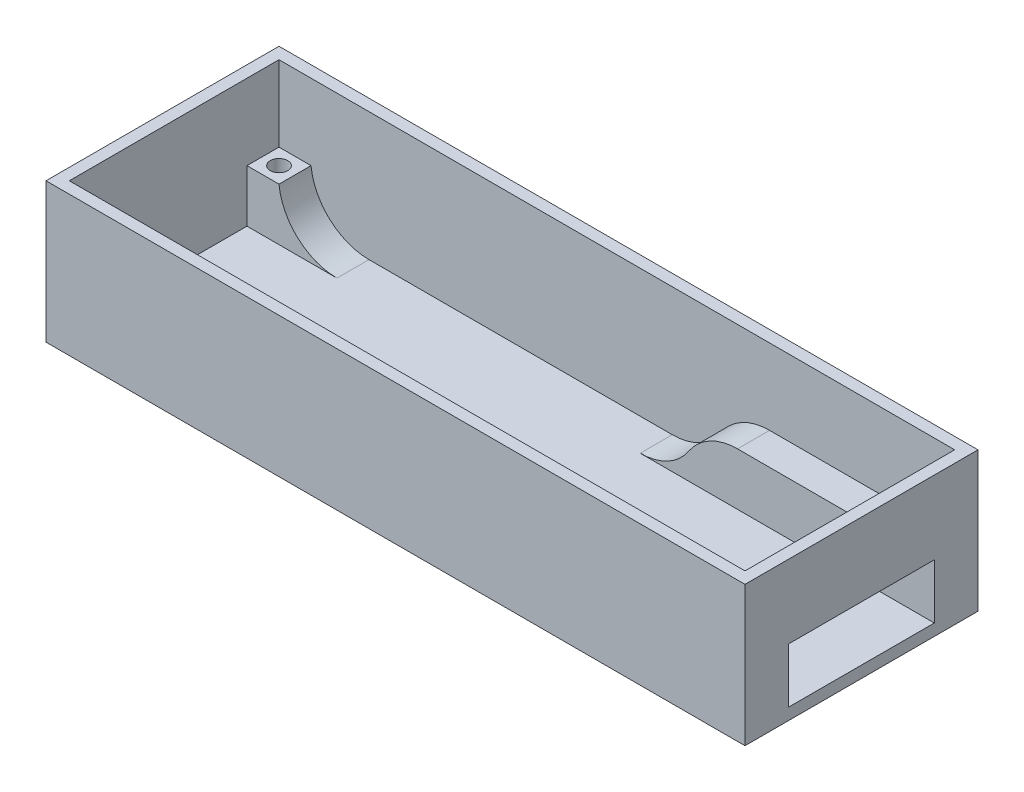
ISO-10303-21;
HEADER;
FILE_DESCRIPTION(('STEP AP214'),'2;1');
FILE_NAME('part.step','',(''),(''),'','','');
FILE_SCHEMA(('AUTOMOTIVE_DESIGN { 1 0 10303 214 1 1 1 1 }'));
ENDSEC;
DATA;
#1=APPLICATION_CONTEXT('core data for automotive mechanical design processes');
#2=APPLICATION_PROTOCOL_DEFINITION('international standard','automotive_design',2000,#1);
#3=PRODUCT_CONTEXT('',#1,'mechanical');
#4=PRODUCT('Part','Part','',(#3));
#5=PRODUCT_RELATED_PRODUCT_CATEGORY('part','',(#4));
#6=PRODUCT_DEFINITION_FORMATION('','',#4);
#7=PRODUCT_DEFINITION_CONTEXT('part definition',#1,'design');
#8=PRODUCT_DEFINITION('design','',#6,#7);
#9=PRODUCT_DEFINITION_SHAPE('','',#8);
#10=(LENGTH_UNIT() NAMED_UNIT(*) SI_UNIT(.MILLI.,.METRE.));
#11=(NAMED_UNIT(*) PLANE_ANGLE_UNIT() SI_UNIT($,.RADIAN.));
#12=(NAMED_UNIT(*) SI_UNIT($,.STERADIAN.) SOLID_ANGLE_UNIT());
#13=UNCERTAINTY_MEASURE_WITH_UNIT(LENGTH_MEASURE(1.E-05),#10,'distance_accuracy_value','');
#14=(GEOMETRIC_REPRESENTATION_CONTEXT(3) GLOBAL_UNCERTAINTY_ASSIGNED_CONTEXT((#13)) GLOBAL_UNIT_ASSIGNED_CONTEXT((#10,
#11,#12)) REPRESENTATION_CONTEXT('',''));
#15=CARTESIAN_POINT('',(0.,0.,0.));
#16=DIRECTION('',(0.,0.,1.));
#17=DIRECTION('',(1.,0.,0.));
#18=AXIS2_PLACEMENT_3D('',#15,#16,#17);
#19=CARTESIAN_POINT('',(29.,12.,10.));
#20=DIRECTION('',(-1.,0.,0.));
#21=DIRECTION('',(0.,0.,1.));
#22=AXIS2_PLACEMENT_3D('',#19,#20,#21);
#23=PLANE('',#22);
#24=DIRECTION('',(0.,1.,0.));
#25=VECTOR('',#24,1.);
#26=CARTESIAN_POINT('',(29.,12.,6.25));
#27=LINE('',#26,#25);
#28=CARTESIAN_POINT('',(29.,5.5,6.25));
#29=VERTEX_POINT('',#28);
#30=CARTESIAN_POINT('',(29.,5.7,6.25));
#31=VERTEX_POINT('',#30);
#32=EDGE_CURVE('E218',#29,#31,#27,.T.);
#33=ORIENTED_EDGE('',*,*,#32,.F.);
#34=DIRECTION('',(0.,0.,-1.));
#35=VECTOR('',#34,1.);
#36=CARTESIAN_POINT('',(29.,5.5,9.));
#37=LINE('',#36,#35);
#38=CARTESIAN_POINT('',(29.,5.5,9.));
#39=VERTEX_POINT('',#38);
#40=EDGE_CURVE('E204',#39,#29,#37,.T.);
#41=ORIENTED_EDGE('',*,*,#40,.F.);
#42=DIRECTION('',(0.,-1.,0.));
#43=VECTOR('',#42,1.);
#44=CARTESIAN_POINT('',(29.,12.,9.));
#45=LINE('',#44,#43);
#46=CARTESIAN_POINT('',(29.,12.,9.));
#47=VERTEX_POINT('',#46);
#48=EDGE_CURVE('E215',#47,#39,#45,.T.);
#49=ORIENTED_EDGE('',*,*,#48,.F.);
#50=DIRECTION('',(0.,0.,-1.));
#51=VECTOR('',#50,1.);
#52=CARTESIAN_POINT('',(29.,12.,0.));
#53=LINE('',#52,#51);
#54=CARTESIAN_POINT('',(29.,12.,-9.));
#55=VERTEX_POINT('',#54);
#56=EDGE_CURVE('E245',#47,#55,#53,.T.);
#57=ORIENTED_EDGE('',*,*,#56,.T.);
#58=DIRECTION('',(0.,-1.,0.));
#59=VECTOR('',#58,1.);
#60=CARTESIAN_POINT('',(29.,12.,-9.));
#61=LINE('',#60,#59);
#62=CARTESIAN_POINT('',(29.,5.5,-9.));
#63=VERTEX_POINT('',#62);
#64=EDGE_CURVE('E227',#55,#63,#61,.T.);
#65=ORIENTED_EDGE('',*,*,#64,.T.);
#66=DIRECTION('',(0.,0.,-1.));
#67=VECTOR('',#66,1.);
#68=CARTESIAN_POINT('',(29.,5.5,-9.));
#69=LINE('',#68,#67);
#70=CARTESIAN_POINT('',(29.,5.5,-6.25));
#71=VERTEX_POINT('',#70);
#72=EDGE_CURVE('E383',#71,#63,#69,.T.);
#73=ORIENTED_EDGE('',*,*,#72,.F.);
#74=DIRECTION('',(0.,-1.,0.));
#75=VECTOR('',#74,1.);
#76=CARTESIAN_POINT('',(29.,12.,-6.25));
#77=LINE('',#76,#75);
#78=CARTESIAN_POINT('',(29.,5.7,-6.25));
#79=VERTEX_POINT('',#78);
#80=EDGE_CURVE('E406',#79,#71,#77,.T.);
#81=ORIENTED_EDGE('',*,*,#80,.F.);
#82=DIRECTION('',(0.,0.,-1.));
#83=VECTOR('',#82,1.);
#84=CARTESIAN_POINT('',(29.,5.7,10.));
#85=LINE('',#84,#83);
#86=EDGE_CURVE('E278',#31,#79,#85,.T.);
#87=ORIENTED_EDGE('',*,*,#86,.F.);
#88=EDGE_LOOP('',(#33,#41,#49,#57,#65,#73,#81,#87));
#89=FACE_BOUND('',#88,.T.);
#90=ADVANCED_FACE('F37',(#89),#23,.T.);
#91=CARTESIAN_POINT('',(-30.,12.,9.));
#92=DIRECTION('',(0.,0.,-1.));
#93=DIRECTION('',(-1.,0.,0.));
#94=AXIS2_PLACEMENT_3D('',#91,#92,#93);
#95=PLANE('',#94);
#96=DIRECTION('',(1.,0.,0.));
#97=VECTOR('',#96,1.);
#98=CARTESIAN_POINT('',(0.,1.,9.));
#99=LINE('',#98,#97);
#100=CARTESIAN_POINT('',(-21.2750628144669,1.,9.));
#101=VERTEX_POINT('',#100);
#102=CARTESIAN_POINT('',(4.75775468323431,1.,9.));
#103=VERTEX_POINT('',#102);
#104=EDGE_CURVE('E236',#101,#103,#99,.T.);
#105=ORIENTED_EDGE('',*,*,#104,.F.);
#106=CARTESIAN_POINT('',(-21.2750628144669,6.,9.));
#107=DIRECTION('',(0.,0.,-1.));
#108=DIRECTION('',(-1.,0.,0.));
#109=AXIS2_PLACEMENT_3D('',#106,#107,#108);
#110=CIRCLE('',#109,5.);
#111=CARTESIAN_POINT('',(-26.25,5.5,9.));
#112=VERTEX_POINT('',#111);
#113=EDGE_CURVE('E293',#101,#112,#110,.T.);
#114=ORIENTED_EDGE('',*,*,#113,.T.);
#115=DIRECTION('',(1.,0.,0.));
#116=VECTOR('',#115,1.);
#117=CARTESIAN_POINT('',(-29.,5.5,9.));
#118=LINE('',#117,#116);
#119=CARTESIAN_POINT('',(-29.,5.5,9.));
#120=VERTEX_POINT('',#119);
#121=EDGE_CURVE('E339',#120,#112,#118,.T.);
#122=ORIENTED_EDGE('',*,*,#121,.F.);
#123=DIRECTION('',(0.,-1.,0.));
#124=VECTOR('',#123,1.);
#125=CARTESIAN_POINT('',(-29.,12.,9.));
#126=LINE('',#125,#124);
#127=CARTESIAN_POINT('',(-29.,12.,9.));
#128=VERTEX_POINT('',#127);
#129=EDGE_CURVE('E226',#128,#120,#126,.T.);
#130=ORIENTED_EDGE('',*,*,#129,.F.);
#131=DIRECTION('',(1.,0.,0.));
#132=VECTOR('',#131,1.);
#133=CARTESIAN_POINT('',(0.,12.,9.));
#134=LINE('',#133,#132);
#135=EDGE_CURVE('E225',#128,#47,#134,.T.);
#136=ORIENTED_EDGE('',*,*,#135,.T.);
#137=ORIENTED_EDGE('',*,*,#48,.T.);
#138=DIRECTION('',(1.,0.,0.));
#139=VECTOR('',#138,1.);
#140=CARTESIAN_POINT('',(29.,5.5,9.));
#141=LINE('',#140,#139);
#142=CARTESIAN_POINT('',(13.1094012274793,5.5,9.));
#143=VERTEX_POINT('',#142);
#144=EDGE_CURVE('E199',#143,#39,#141,.T.);
#145=ORIENTED_EDGE('',*,*,#144,.F.);
#146=CARTESIAN_POINT('',(13.1094012274793,0.5,9.));
#147=DIRECTION('',(0.,0.,-1.));
#148=DIRECTION('',(-1.,0.,0.));
#149=AXIS2_PLACEMENT_3D('',#146,#147,#148);
#150=CIRCLE('',#149,5.);
#151=CARTESIAN_POINT('',(8.93357795535683,3.25,9.));
#152=VERTEX_POINT('',#151);
#153=EDGE_CURVE('E45',#143,#152,#150,.F.);
#154=ORIENTED_EDGE('',*,*,#153,.T.);
#155=CARTESIAN_POINT('',(4.75775468323431,6.,9.));
#156=DIRECTION('',(0.,0.,-1.));
#157=DIRECTION('',(-1.,0.,0.));
#158=AXIS2_PLACEMENT_3D('',#155,#156,#157);
#159=CIRCLE('',#158,5.);
#160=EDGE_CURVE('E291',#152,#103,#159,.T.);
#161=ORIENTED_EDGE('',*,*,#160,.T.);
#162=EDGE_LOOP('',(#105,#114,#122,#130,#136,#137,#145,#154,#161));
#163=FACE_BOUND('',#162,.T.);
#164=ADVANCED_FACE('F222',(#163),#95,.T.);
#165=CARTESIAN_POINT('',(-30.,12.,-9.));
#166=DIRECTION('',(0.,0.,1.));
#167=DIRECTION('',(1.,0.,0.));
#168=AXIS2_PLACEMENT_3D('',#165,#166,#167);
#169=PLANE('',#168);
#170=DIRECTION('',(-1.,0.,0.));
#171=VECTOR('',#170,1.);
#172=CARTESIAN_POINT('',(-29.,5.5,-9.));
#173=LINE('',#172,#171);
#174=CARTESIAN_POINT('',(-26.25,5.5,-9.));
#175=VERTEX_POINT('',#174);
#176=CARTESIAN_POINT('',(-29.,5.5,-9.));
#177=VERTEX_POINT('',#176);
#178=EDGE_CURVE('E372',#175,#177,#173,.T.);
#179=ORIENTED_EDGE('',*,*,#178,.F.);
#180=CARTESIAN_POINT('',(-21.2750628144669,6.,-9.));
#181=DIRECTION('',(0.,0.,1.));
#182=DIRECTION('',(1.,0.,0.));
#183=AXIS2_PLACEMENT_3D('',#180,#181,#182);
#184=CIRCLE('',#183,5.);
#185=CARTESIAN_POINT('',(-21.2750628144669,1.,-9.));
#186=VERTEX_POINT('',#185);
#187=EDGE_CURVE('E297',#175,#186,#184,.T.);
#188=ORIENTED_EDGE('',*,*,#187,.T.);
#189=DIRECTION('',(-1.,0.,0.));
#190=VECTOR('',#189,1.);
#191=CARTESIAN_POINT('',(0.,1.,-9.));
#192=LINE('',#191,#190);
#193=CARTESIAN_POINT('',(4.75775468323431,1.,-9.));
#194=VERTEX_POINT('',#193);
#195=EDGE_CURVE('E239',#194,#186,#192,.T.);
#196=ORIENTED_EDGE('',*,*,#195,.F.);
#197=CARTESIAN_POINT('',(4.75775468323431,6.,-9.));
#198=DIRECTION('',(0.,0.,1.));
#199=DIRECTION('',(1.,0.,0.));
#200=AXIS2_PLACEMENT_3D('',#197,#198,#199);
#201=CIRCLE('',#200,5.);
#202=CARTESIAN_POINT('',(8.93357795535683,3.25,-9.));
#203=VERTEX_POINT('',#202);
#204=EDGE_CURVE('E295',#194,#203,#201,.T.);
#205=ORIENTED_EDGE('',*,*,#204,.T.);
#206=CARTESIAN_POINT('',(13.1094012274793,0.5,-9.));
#207=DIRECTION('',(0.,0.,1.));
#208=DIRECTION('',(1.,0.,0.));
#209=AXIS2_PLACEMENT_3D('',#206,#207,#208);
#210=CIRCLE('',#209,5.);
#211=CARTESIAN_POINT('',(13.1094012274793,5.5,-9.));
#212=VERTEX_POINT('',#211);
#213=EDGE_CURVE('E11',#203,#212,#210,.F.);
#214=ORIENTED_EDGE('',*,*,#213,.T.);
#215=DIRECTION('',(-1.,0.,0.));
#216=VECTOR('',#215,1.);
#217=CARTESIAN_POINT('',(29.,5.5,-9.));
#218=LINE('',#217,#216);
#219=EDGE_CURVE('E387',#63,#212,#218,.T.);
#220=ORIENTED_EDGE('',*,*,#219,.F.);
#221=ORIENTED_EDGE('',*,*,#64,.F.);
#222=DIRECTION('',(-1.,0.,0.));
#223=VECTOR('',#222,1.);
#224=CARTESIAN_POINT('',(0.,12.,-9.));
#225=LINE('',#224,#223);
#226=CARTESIAN_POINT('',(-29.,12.,-9.));
#227=VERTEX_POINT('',#226);
#228=EDGE_CURVE('E247',#55,#227,#225,.T.);
#229=ORIENTED_EDGE('',*,*,#228,.T.);
#230=DIRECTION('',(0.,-1.,0.));
#231=VECTOR('',#230,1.);
#232=CARTESIAN_POINT('',(-29.,12.,-9.));
#233=LINE('',#232,#231);
#234=EDGE_CURVE('E233',#227,#177,#233,.T.);
#235=ORIENTED_EDGE('',*,*,#234,.T.);
#236=EDGE_LOOP('',(#179,#188,#196,#205,#214,#220,#221,#229,#235));
#237=FACE_BOUND('',#236,.T.);
#238=ADVANCED_FACE('F421',(#237),#169,.T.);
#239=CARTESIAN_POINT('',(0.,12.,0.));
#240=DIRECTION('',(0.,-1.,0.));
#241=DIRECTION('',(0.,0.,-1.));
#242=AXIS2_PLACEMENT_3D('',#239,#240,#241);
#243=PLANE('',#242);
#244=DIRECTION('',(0.,0.,1.));
#245=VECTOR('',#244,1.);
#246=CARTESIAN_POINT('',(-30.,12.,10.));
#247=LINE('',#246,#245);
#248=CARTESIAN_POINT('',(-30.,12.,-10.));
#249=VERTEX_POINT('',#248);
#250=CARTESIAN_POINT('',(-30.,12.,10.));
#251=VERTEX_POINT('',#250);
#252=EDGE_CURVE('E249',#249,#251,#247,.T.);
#253=ORIENTED_EDGE('',*,*,#252,.T.);
#254=DIRECTION('',(1.,0.,0.));
#255=VECTOR('',#254,1.);
#256=CARTESIAN_POINT('',(-30.,12.,10.));
#257=LINE('',#256,#255);
#258=CARTESIAN_POINT('',(30.,12.,10.));
#259=VERTEX_POINT('',#258);
#260=EDGE_CURVE('E252',#251,#259,#257,.T.);
#261=ORIENTED_EDGE('',*,*,#260,.T.);
#262=DIRECTION('',(0.,0.,-1.));
#263=VECTOR('',#262,1.);
#264=CARTESIAN_POINT('',(30.,12.,10.));
#265=LINE('',#264,#263);
#266=CARTESIAN_POINT('',(30.,12.,-10.));
#267=VERTEX_POINT('',#266);
#268=EDGE_CURVE('E255',#259,#267,#265,.T.);
#269=ORIENTED_EDGE('',*,*,#268,.T.);
#270=DIRECTION('',(-1.,0.,0.));
#271=VECTOR('',#270,1.);
#272=CARTESIAN_POINT('',(-30.,12.,-10.));
#273=LINE('',#272,#271);
#274=EDGE_CURVE('E257',#267,#249,#273,.T.);
#275=ORIENTED_EDGE('',*,*,#274,.T.);
#276=EDGE_LOOP('',(#253,#261,#269,#275));
#277=FACE_BOUND('',#276,.T.);
#278=DIRECTION('',(0.,0.,1.));
#279=VECTOR('',#278,1.);
#280=CARTESIAN_POINT('',(-29.,12.,0.));
#281=LINE('',#280,#279);
#282=EDGE_CURVE('E242',#227,#128,#281,.T.);
#283=ORIENTED_EDGE('',*,*,#282,.F.);
#284=ORIENTED_EDGE('',*,*,#228,.F.);
#285=ORIENTED_EDGE('',*,*,#56,.F.);
#286=ORIENTED_EDGE('',*,*,#135,.F.);
#287=EDGE_LOOP('',(#283,#284,#285,#286));
#288=FACE_BOUND('',#287,.T.);
#289=ADVANCED_FACE('F451',(#277,#288),#243,.F.);
#290=CARTESIAN_POINT('',(-30.,12.,10.));
#291=DIRECTION('',(1.,0.,0.));
#292=DIRECTION('',(0.,0.,-1.));
#293=AXIS2_PLACEMENT_3D('',#290,#291,#292);
#294=PLANE('',#293);
#295=DIRECTION('',(0.,0.,1.));
#296=VECTOR('',#295,1.);
#297=CARTESIAN_POINT('',(-30.,0.,10.));
#298=LINE('',#297,#296);
#299=CARTESIAN_POINT('',(-30.,0.,-10.));
#300=VERTEX_POINT('',#299);
#301=CARTESIAN_POINT('',(-30.,0.,10.));
#302=VERTEX_POINT('',#301);
#303=EDGE_CURVE('E230',#300,#302,#298,.T.);
#304=ORIENTED_EDGE('',*,*,#303,.T.);
#305=DIRECTION('',(0.,-1.,0.));
#306=VECTOR('',#305,1.);
#307=CARTESIAN_POINT('',(-30.,12.,10.));
#308=LINE('',#307,#306);
#309=EDGE_CURVE('E275',#251,#302,#308,.T.);
#310=ORIENTED_EDGE('',*,*,#309,.F.);
#311=ORIENTED_EDGE('',*,*,#252,.F.);
#312=DIRECTION('',(0.,-1.,0.));
#313=VECTOR('',#312,1.);
#314=CARTESIAN_POINT('',(-30.,12.,-10.));
#315=LINE('',#314,#313);
#316=EDGE_CURVE('E259',#249,#300,#315,.T.);
#317=ORIENTED_EDGE('',*,*,#316,.T.);
#318=EDGE_LOOP('',(#304,#310,#311,#317));
#319=FACE_BOUND('',#318,.T.);
#320=ADVANCED_FACE('F496',(#319),#294,.F.);
#321=CARTESIAN_POINT('',(-30.,12.,10.));
#322=DIRECTION('',(0.,0.,-1.));
#323=DIRECTION('',(-1.,0.,0.));
#324=AXIS2_PLACEMENT_3D('',#321,#322,#323);
#325=PLANE('',#324);
#326=DIRECTION('',(1.,0.,0.));
#327=VECTOR('',#326,1.);
#328=CARTESIAN_POINT('',(-30.,0.,10.));
#329=LINE('',#328,#327);
#330=CARTESIAN_POINT('',(30.,0.,10.));
#331=VERTEX_POINT('',#330);
#332=EDGE_CURVE('E262',#302,#331,#329,.T.);
#333=ORIENTED_EDGE('',*,*,#332,.T.);
#334=DIRECTION('',(0.,-1.,0.));
#335=VECTOR('',#334,1.);
#336=CARTESIAN_POINT('',(30.,12.,10.));
#337=LINE('',#336,#335);
#338=EDGE_CURVE('E272',#259,#331,#337,.T.);
#339=ORIENTED_EDGE('',*,*,#338,.F.);
#340=ORIENTED_EDGE('',*,*,#260,.F.);
#341=ORIENTED_EDGE('',*,*,#309,.T.);
#342=EDGE_LOOP('',(#333,#339,#340,#341));
#343=FACE_BOUND('',#342,.T.);
#344=ADVANCED_FACE('F509',(#343),#325,.F.);
#345=CARTESIAN_POINT('',(30.,12.,10.));
#346=DIRECTION('',(-1.,0.,0.));
#347=DIRECTION('',(0.,0.,1.));
#348=AXIS2_PLACEMENT_3D('',#345,#346,#347);
#349=PLANE('',#348);
#350=DIRECTION('',(0.,1.,0.));
#351=VECTOR('',#350,1.);
#352=CARTESIAN_POINT('',(30.,5.7,-6.25));
#353=LINE('',#352,#351);
#354=CARTESIAN_POINT('',(30.,1.,-6.25));
#355=VERTEX_POINT('',#354);
#356=CARTESIAN_POINT('',(30.,5.7,-6.25));
#357=VERTEX_POINT('',#356);
#358=EDGE_CURVE('E394',#355,#357,#353,.T.);
#359=ORIENTED_EDGE('',*,*,#358,.F.);
#360=DIRECTION('',(0.,0.,-1.));
#361=VECTOR('',#360,1.);
#362=CARTESIAN_POINT('',(30.,1.,-6.25));
#363=LINE('',#362,#361);
#364=CARTESIAN_POINT('',(30.,1.,6.25));
#365=VERTEX_POINT('',#364);
#366=EDGE_CURVE('E392',#365,#355,#363,.T.);
#367=ORIENTED_EDGE('',*,*,#366,.F.);
#368=DIRECTION('',(0.,-1.,0.));
#369=VECTOR('',#368,1.);
#370=CARTESIAN_POINT('',(30.,5.7,6.25));
#371=LINE('',#370,#369);
#372=CARTESIAN_POINT('',(30.,5.7,6.25));
#373=VERTEX_POINT('',#372);
#374=EDGE_CURVE('E400',#373,#365,#371,.T.);
#375=ORIENTED_EDGE('',*,*,#374,.F.);
#376=DIRECTION('',(0.,0.,1.));
#377=VECTOR('',#376,1.);
#378=CARTESIAN_POINT('',(30.,5.7,6.25));
#379=LINE('',#378,#377);
#380=EDGE_CURVE('E397',#357,#373,#379,.T.);
#381=ORIENTED_EDGE('',*,*,#380,.F.);
#382=EDGE_LOOP('',(#359,#367,#375,#381));
#383=FACE_BOUND('',#382,.T.);
#384=DIRECTION('',(0.,0.,-1.));
#385=VECTOR('',#384,1.);
#386=CARTESIAN_POINT('',(30.,0.,10.));
#387=LINE('',#386,#385);
#388=CARTESIAN_POINT('',(30.,0.,-10.));
#389=VERTEX_POINT('',#388);
#390=EDGE_CURVE('E264',#331,#389,#387,.T.);
#391=ORIENTED_EDGE('',*,*,#390,.T.);
#392=DIRECTION('',(0.,-1.,0.));
#393=VECTOR('',#392,1.);
#394=CARTESIAN_POINT('',(30.,12.,-10.));
#395=LINE('',#394,#393);
#396=EDGE_CURVE('E269',#267,#389,#395,.T.);
#397=ORIENTED_EDGE('',*,*,#396,.F.);
#398=ORIENTED_EDGE('',*,*,#268,.F.);
#399=ORIENTED_EDGE('',*,*,#338,.T.);
#400=EDGE_LOOP('',(#391,#397,#398,#399));
#401=FACE_BOUND('',#400,.T.);
#402=ADVANCED_FACE('F505',(#383,#401),#349,.F.);
#403=CARTESIAN_POINT('',(-30.,12.,-10.));
#404=DIRECTION('',(0.,0.,1.));
#405=DIRECTION('',(1.,0.,0.));
#406=AXIS2_PLACEMENT_3D('',#403,#404,#405);
#407=PLANE('',#406);
#408=DIRECTION('',(-1.,0.,0.));
#409=VECTOR('',#408,1.);
#410=CARTESIAN_POINT('',(-30.,0.,-10.));
#411=LINE('',#410,#409);
#412=EDGE_CURVE('E253',#389,#300,#411,.T.);
#413=ORIENTED_EDGE('',*,*,#412,.T.);
#414=ORIENTED_EDGE('',*,*,#316,.F.);
#415=ORIENTED_EDGE('',*,*,#274,.F.);
#416=ORIENTED_EDGE('',*,*,#396,.T.);
#417=EDGE_LOOP('',(#413,#414,#415,#416));
#418=FACE_BOUND('',#417,.T.);
#419=ADVANCED_FACE('F501',(#418),#407,.F.);
#420=CARTESIAN_POINT('',(0.,0.,0.));
#421=DIRECTION('',(0.,-1.,0.));
#422=DIRECTION('',(0.,0.,-1.));
#423=AXIS2_PLACEMENT_3D('',#420,#421,#422);
#424=PLANE('',#423);
#425=ORIENTED_EDGE('',*,*,#303,.F.);
#426=ORIENTED_EDGE('',*,*,#412,.F.);
#427=ORIENTED_EDGE('',*,*,#390,.F.);
#428=ORIENTED_EDGE('',*,*,#332,.F.);
#429=EDGE_LOOP('',(#425,#426,#427,#428));
#430=FACE_BOUND('',#429,.T.);
#431=ADVANCED_FACE('F498',(#430),#424,.T.);
#432=CARTESIAN_POINT('',(-29.,12.,10.));
#433=DIRECTION('',(1.,0.,0.));
#434=DIRECTION('',(0.,0.,-1.));
#435=AXIS2_PLACEMENT_3D('',#432,#433,#434);
#436=PLANE('',#435);
#437=DIRECTION('',(0.,0.,1.));
#438=VECTOR('',#437,1.);
#439=CARTESIAN_POINT('',(-29.,5.5,9.));
#440=LINE('',#439,#438);
#441=CARTESIAN_POINT('',(-29.,5.5,6.25));
#442=VERTEX_POINT('',#441);
#443=EDGE_CURVE('E348',#442,#120,#440,.T.);
#444=ORIENTED_EDGE('',*,*,#443,.F.);
#445=DIRECTION('',(0.,-1.,0.));
#446=VECTOR('',#445,1.);
#447=CARTESIAN_POINT('',(-29.,5.5,6.25));
#448=LINE('',#447,#446);
#449=CARTESIAN_POINT('',(-29.,1.,6.25));
#450=VERTEX_POINT('',#449);
#451=EDGE_CURVE('E351',#442,#450,#448,.T.);
#452=ORIENTED_EDGE('',*,*,#451,.T.);
#453=DIRECTION('',(0.,0.,1.));
#454=VECTOR('',#453,1.);
#455=CARTESIAN_POINT('',(-29.,1.,0.));
#456=LINE('',#455,#454);
#457=CARTESIAN_POINT('',(-29.,1.,-6.25));
#458=VERTEX_POINT('',#457);
#459=EDGE_CURVE('E416',#458,#450,#456,.T.);
#460=ORIENTED_EDGE('',*,*,#459,.F.);
#461=DIRECTION('',(0.,-1.,0.));
#462=VECTOR('',#461,1.);
#463=CARTESIAN_POINT('',(-29.,5.5,-6.25));
#464=LINE('',#463,#462);
#465=CARTESIAN_POINT('',(-29.,5.5,-6.25));
#466=VERTEX_POINT('',#465);
#467=EDGE_CURVE('E375',#466,#458,#464,.T.);
#468=ORIENTED_EDGE('',*,*,#467,.F.);
#469=DIRECTION('',(0.,0.,1.));
#470=VECTOR('',#469,1.);
#471=CARTESIAN_POINT('',(-29.,5.5,-9.));
#472=LINE('',#471,#470);
#473=EDGE_CURVE('E363',#177,#466,#472,.T.);
#474=ORIENTED_EDGE('',*,*,#473,.F.);
#475=ORIENTED_EDGE('',*,*,#234,.F.);
#476=ORIENTED_EDGE('',*,*,#282,.T.);
#477=ORIENTED_EDGE('',*,*,#129,.T.);
#478=EDGE_LOOP('',(#444,#452,#460,#468,#474,#475,#476,#477));
#479=FACE_BOUND('',#478,.T.);
#480=ADVANCED_FACE('F452',(#479),#436,.T.);
#481=CARTESIAN_POINT('',(0.,1.,0.));
#482=DIRECTION('',(0.,-1.,0.));
#483=DIRECTION('',(0.,0.,-1.));
#484=AXIS2_PLACEMENT_3D('',#481,#482,#483);
#485=PLANE('',#484);
#486=DIRECTION('',(-1.,0.,0.));
#487=VECTOR('',#486,1.);
#488=CARTESIAN_POINT('',(-29.,1.,6.25));
#489=LINE('',#488,#487);
#490=CARTESIAN_POINT('',(-21.2750628144669,1.,6.25));
#491=VERTEX_POINT('',#490);
#492=EDGE_CURVE('E337',#491,#450,#489,.T.);
#493=ORIENTED_EDGE('',*,*,#492,.F.);
#494=DIRECTION('',(0.,0.,-1.));
#495=VECTOR('',#494,1.);
#496=CARTESIAN_POINT('',(-21.2750628144669,1.,0.));
#497=LINE('',#496,#495);
#498=EDGE_CURVE('E289',#491,#101,#497,.F.);
#499=ORIENTED_EDGE('',*,*,#498,.T.);
#500=ORIENTED_EDGE('',*,*,#104,.T.);
#501=DIRECTION('',(0.,0.,-1.));
#502=VECTOR('',#501,1.);
#503=CARTESIAN_POINT('',(4.75775468323431,1.,0.));
#504=LINE('',#503,#502);
#505=CARTESIAN_POINT('',(4.75775468323431,1.,6.25));
#506=VERTEX_POINT('',#505);
#507=EDGE_CURVE('E283',#103,#506,#504,.T.);
#508=ORIENTED_EDGE('',*,*,#507,.T.);
#509=DIRECTION('',(1.,0.,0.));
#510=VECTOR('',#509,1.);
#511=CARTESIAN_POINT('',(18.,1.,6.25));
#512=LINE('',#511,#510);
#513=EDGE_CURVE('E404',#506,#365,#512,.T.);
#514=ORIENTED_EDGE('',*,*,#513,.T.);
#515=ORIENTED_EDGE('',*,*,#366,.T.);
#516=DIRECTION('',(1.,0.,0.));
#517=VECTOR('',#516,1.);
#518=CARTESIAN_POINT('',(18.,1.,-6.25));
#519=LINE('',#518,#517);
#520=CARTESIAN_POINT('',(4.75775468323431,1.,-6.25));
#521=VERTEX_POINT('',#520);
#522=EDGE_CURVE('E403',#521,#355,#519,.T.);
#523=ORIENTED_EDGE('',*,*,#522,.F.);
#524=DIRECTION('',(0.,0.,-1.));
#525=VECTOR('',#524,1.);
#526=CARTESIAN_POINT('',(4.75775468323431,1.,0.));
#527=LINE('',#526,#525);
#528=EDGE_CURVE('E281',#521,#194,#527,.T.);
#529=ORIENTED_EDGE('',*,*,#528,.T.);
#530=ORIENTED_EDGE('',*,*,#195,.T.);
#531=DIRECTION('',(0.,0.,-1.));
#532=VECTOR('',#531,1.);
#533=CARTESIAN_POINT('',(-21.2750628144669,1.,0.));
#534=LINE('',#533,#532);
#535=CARTESIAN_POINT('',(-21.2750628144669,1.,-6.25));
#536=VERTEX_POINT('',#535);
#537=EDGE_CURVE('E286',#186,#536,#534,.F.);
#538=ORIENTED_EDGE('',*,*,#537,.T.);
#539=DIRECTION('',(1.,0.,0.));
#540=VECTOR('',#539,1.);
#541=CARTESIAN_POINT('',(-29.,1.,-6.25));
#542=LINE('',#541,#540);
#543=EDGE_CURVE('E360',#458,#536,#542,.T.);
#544=ORIENTED_EDGE('',*,*,#543,.F.);
#545=ORIENTED_EDGE('',*,*,#459,.T.);
#546=EDGE_LOOP('',(#493,#499,#500,#508,#514,#515,#523,#529,#530,#538,#544,#545));
#547=FACE_BOUND('',#546,.T.);
#548=ADVANCED_FACE('F436',(#547),#485,.F.);
#549=CARTESIAN_POINT('',(18.,5.7,6.25));
#550=DIRECTION('',(0.,0.,1.));
#551=DIRECTION('',(0.,-1.,0.));
#552=AXIS2_PLACEMENT_3D('',#549,#550,#551);
#553=PLANE('',#552);
#554=CARTESIAN_POINT('',(4.75775468323431,6.,6.25));
#555=DIRECTION('',(0.,0.,1.));
#556=DIRECTION('',(0.,-1.,0.));
#557=AXIS2_PLACEMENT_3D('',#554,#555,#556);
#558=CIRCLE('',#557,5.);
#559=CARTESIAN_POINT('',(8.93357795535683,3.25,6.25));
#560=VERTEX_POINT('',#559);
#561=EDGE_CURVE('E304',#506,#560,#558,.T.);
#562=ORIENTED_EDGE('',*,*,#561,.T.);
#563=CARTESIAN_POINT('',(13.1094012274793,0.5,6.25));
#564=DIRECTION('',(0.,0.,1.));
#565=DIRECTION('',(0.,-1.,0.));
#566=AXIS2_PLACEMENT_3D('',#563,#564,#565);
#567=CIRCLE('',#566,5.);
#568=CARTESIAN_POINT('',(13.1094012274793,5.5,6.25));
#569=VERTEX_POINT('',#568);
#570=EDGE_CURVE('E312',#560,#569,#567,.F.);
#571=ORIENTED_EDGE('',*,*,#570,.T.);
#572=DIRECTION('',(-1.,0.,0.));
#573=VECTOR('',#572,1.);
#574=CARTESIAN_POINT('',(29.,5.5,6.25));
#575=LINE('',#574,#573);
#576=EDGE_CURVE('E219',#29,#569,#575,.T.);
#577=ORIENTED_EDGE('',*,*,#576,.F.);
#578=ORIENTED_EDGE('',*,*,#32,.T.);
#579=DIRECTION('',(1.,0.,0.));
#580=VECTOR('',#579,1.);
#581=CARTESIAN_POINT('',(18.,5.7,6.25));
#582=LINE('',#581,#580);
#583=EDGE_CURVE('E407',#31,#373,#582,.T.);
#584=ORIENTED_EDGE('',*,*,#583,.T.);
#585=ORIENTED_EDGE('',*,*,#374,.T.);
#586=ORIENTED_EDGE('',*,*,#513,.F.);
#587=EDGE_LOOP('',(#562,#571,#577,#578,#584,#585,#586));
#588=FACE_BOUND('',#587,.T.);
#589=ADVANCED_FACE('F329',(#588),#553,.F.);
#590=CARTESIAN_POINT('',(18.,5.7,6.25));
#591=DIRECTION('',(0.,1.,0.));
#592=DIRECTION('',(0.,0.,1.));
#593=AXIS2_PLACEMENT_3D('',#590,#591,#592);
#594=PLANE('',#593);
#595=ORIENTED_EDGE('',*,*,#86,.T.);
#596=DIRECTION('',(1.,0.,0.));
#597=VECTOR('',#596,1.);
#598=CARTESIAN_POINT('',(18.,5.7,-6.25));
#599=LINE('',#598,#597);
#600=EDGE_CURVE('E409',#79,#357,#599,.T.);
#601=ORIENTED_EDGE('',*,*,#600,.T.);
#602=ORIENTED_EDGE('',*,*,#380,.T.);
#603=ORIENTED_EDGE('',*,*,#583,.F.);
#604=EDGE_LOOP('',(#595,#601,#602,#603));
#605=FACE_BOUND('',#604,.T.);
#606=ADVANCED_FACE('F581',(#605),#594,.F.);
#607=CARTESIAN_POINT('',(18.,5.7,-6.25));
#608=DIRECTION('',(0.,0.,-1.));
#609=DIRECTION('',(-1.,0.,0.));
#610=AXIS2_PLACEMENT_3D('',#607,#608,#609);
#611=PLANE('',#610);
#612=DIRECTION('',(1.,0.,0.));
#613=VECTOR('',#612,1.);
#614=CARTESIAN_POINT('',(29.,5.5,-6.25));
#615=LINE('',#614,#613);
#616=CARTESIAN_POINT('',(13.1094012274793,5.5,-6.25));
#617=VERTEX_POINT('',#616);
#618=EDGE_CURVE('E390',#617,#71,#615,.T.);
#619=ORIENTED_EDGE('',*,*,#618,.F.);
#620=CARTESIAN_POINT('',(13.1094012274793,0.5,-6.25));
#621=DIRECTION('',(0.,0.,-1.));
#622=DIRECTION('',(-1.,0.,0.));
#623=AXIS2_PLACEMENT_3D('',#620,#621,#622);
#624=CIRCLE('',#623,5.);
#625=CARTESIAN_POINT('',(8.93357795535683,3.25,-6.25));
#626=VERTEX_POINT('',#625);
#627=EDGE_CURVE('E60',#617,#626,#624,.F.);
#628=ORIENTED_EDGE('',*,*,#627,.T.);
#629=CARTESIAN_POINT('',(4.75775468323431,6.,-6.25));
#630=DIRECTION('',(0.,0.,-1.));
#631=DIRECTION('',(-1.,0.,0.));
#632=AXIS2_PLACEMENT_3D('',#629,#630,#631);
#633=CIRCLE('',#632,5.);
#634=EDGE_CURVE('E307',#626,#521,#633,.T.);
#635=ORIENTED_EDGE('',*,*,#634,.T.);
#636=ORIENTED_EDGE('',*,*,#522,.T.);
#637=ORIENTED_EDGE('',*,*,#358,.T.);
#638=ORIENTED_EDGE('',*,*,#600,.F.);
#639=ORIENTED_EDGE('',*,*,#80,.T.);
#640=EDGE_LOOP('',(#619,#628,#635,#636,#637,#638,#639));
#641=FACE_BOUND('',#640,.T.);
#642=ADVANCED_FACE('F448',(#641),#611,.F.);
#643=CARTESIAN_POINT('',(0.,5.5,0.));
#644=DIRECTION('',(0.,-1.,0.));
#645=DIRECTION('',(0.,0.,-1.));
#646=AXIS2_PLACEMENT_3D('',#643,#644,#645);
#647=PLANE('',#646);
#648=ORIENTED_EDGE('',*,*,#219,.T.);
#649=DIRECTION('',(0.,0.,-1.));
#650=VECTOR('',#649,1.);
#651=CARTESIAN_POINT('',(13.1094012274793,5.5,0.));
#652=LINE('',#651,#650);
#653=EDGE_CURVE('E314',#212,#617,#652,.F.);
#654=ORIENTED_EDGE('',*,*,#653,.T.);
#655=ORIENTED_EDGE('',*,*,#618,.T.);
#656=ORIENTED_EDGE('',*,*,#72,.T.);
#657=EDGE_LOOP('',(#648,#654,#655,#656));
#658=FACE_BOUND('',#657,.T.);
#659=CARTESIAN_POINT('',(26.5,5.5,-7.625));
#660=DIRECTION('',(0.,1.,0.));
#661=DIRECTION('',(0.,0.,1.));
#662=AXIS2_PLACEMENT_3D('',#659,#660,#661);
#663=CIRCLE('',#662,0.750000000000002);
#664=CARTESIAN_POINT('',(26.5,5.5,-6.875));
#665=VERTEX_POINT('',#664);
#666=EDGE_CURVE('E380',#665,#665,#663,.T.);
#667=ORIENTED_EDGE('',*,*,#666,.F.);
#668=EDGE_LOOP('',(#667));
#669=FACE_BOUND('',#668,.T.);
#670=ADVANCED_FACE('F445',(#658,#669),#647,.F.);
#671=CARTESIAN_POINT('',(26.5,5.5,-7.625));
#672=DIRECTION('',(0.,-1.,0.));
#673=DIRECTION('',(0.,0.,-1.));
#674=AXIS2_PLACEMENT_3D('',#671,#672,#673);
#675=CYLINDRICAL_SURFACE('',#674,0.750000000000002);
#676=ORIENTED_EDGE('',*,*,#666,.T.);
#677=EDGE_LOOP('',(#676));
#678=FACE_BOUND('',#677,.T.);
#679=CARTESIAN_POINT('',(26.5,1.,-7.625));
#680=DIRECTION('',(0.,1.,0.));
#681=DIRECTION('',(0.,0.,1.));
#682=AXIS2_PLACEMENT_3D('',#679,#680,#681);
#683=CIRCLE('',#682,0.750000000000002);
#684=CARTESIAN_POINT('',(26.5,1.,-6.875));
#685=VERTEX_POINT('',#684);
#686=EDGE_CURVE('E379',#685,#685,#683,.T.);
#687=ORIENTED_EDGE('',*,*,#686,.F.);
#688=EDGE_LOOP('',(#687));
#689=FACE_BOUND('',#688,.T.);
#690=ADVANCED_FACE('F570',(#678,#689),#675,.F.);
#691=ORIENTED_EDGE('',*,*,#686,.T.);
#692=EDGE_LOOP('',(#691));
#693=FACE_BOUND('',#692,.T.);
#694=ADVANCED_FACE('F478',(#693),#485,.F.);
#695=CARTESIAN_POINT('',(0.,5.5,0.));
#696=DIRECTION('',(0.,1.,0.));
#697=DIRECTION('',(0.,0.,1.));
#698=AXIS2_PLACEMENT_3D('',#695,#696,#697);
#699=PLANE('',#698);
#700=ORIENTED_EDGE('',*,*,#473,.T.);
#701=DIRECTION('',(1.,0.,0.));
#702=VECTOR('',#701,1.);
#703=CARTESIAN_POINT('',(-29.,5.5,-6.25));
#704=LINE('',#703,#702);
#705=CARTESIAN_POINT('',(-26.25,5.5,-6.25));
#706=VERTEX_POINT('',#705);
#707=EDGE_CURVE('E366',#466,#706,#704,.T.);
#708=ORIENTED_EDGE('',*,*,#707,.T.);
#709=DIRECTION('',(0.,0.,-1.));
#710=VECTOR('',#709,1.);
#711=CARTESIAN_POINT('',(-26.25,5.5,-9.));
#712=LINE('',#711,#710);
#713=EDGE_CURVE('E369',#706,#175,#712,.T.);
#714=ORIENTED_EDGE('',*,*,#713,.T.);
#715=ORIENTED_EDGE('',*,*,#178,.T.);
#716=EDGE_LOOP('',(#700,#708,#714,#715));
#717=FACE_BOUND('',#716,.T.);
#718=CARTESIAN_POINT('',(-27.625,5.5,-7.625));
#719=DIRECTION('',(0.,1.,0.));
#720=DIRECTION('',(0.,0.,1.));
#721=AXIS2_PLACEMENT_3D('',#718,#719,#720);
#722=CIRCLE('',#721,0.750000000000002);
#723=CARTESIAN_POINT('',(-27.625,5.5,-6.875));
#724=VERTEX_POINT('',#723);
#725=EDGE_CURVE('E357',#724,#724,#722,.T.);
#726=ORIENTED_EDGE('',*,*,#725,.F.);
#727=EDGE_LOOP('',(#726));
#728=FACE_BOUND('',#727,.T.);
#729=ADVANCED_FACE('F426',(#717,#728),#699,.T.);
#730=CARTESIAN_POINT('',(-29.,5.5,-6.25));
#731=DIRECTION('',(0.,0.,-1.));
#732=DIRECTION('',(-1.,0.,0.));
#733=AXIS2_PLACEMENT_3D('',#730,#731,#732);
#734=PLANE('',#733);
#735=ORIENTED_EDGE('',*,*,#543,.T.);
#736=CARTESIAN_POINT('',(-21.2750628144669,6.,-6.25));
#737=DIRECTION('',(0.,0.,-1.));
#738=DIRECTION('',(-1.,0.,0.));
#739=AXIS2_PLACEMENT_3D('',#736,#737,#738);
#740=CIRCLE('',#739,5.);
#741=EDGE_CURVE('E302',#536,#706,#740,.T.);
#742=ORIENTED_EDGE('',*,*,#741,.T.);
#743=ORIENTED_EDGE('',*,*,#707,.F.);
#744=ORIENTED_EDGE('',*,*,#467,.T.);
#745=EDGE_LOOP('',(#735,#742,#743,#744));
#746=FACE_BOUND('',#745,.T.);
#747=ADVANCED_FACE('F467',(#746),#734,.F.);
#748=CARTESIAN_POINT('',(-27.625,5.5,-7.625));
#749=DIRECTION('',(0.,-1.,0.));
#750=DIRECTION('',(0.,0.,-1.));
#751=AXIS2_PLACEMENT_3D('',#748,#749,#750);
#752=CYLINDRICAL_SURFACE('',#751,0.750000000000002);
#753=ORIENTED_EDGE('',*,*,#725,.T.);
#754=EDGE_LOOP('',(#753));
#755=FACE_BOUND('',#754,.T.);
#756=CARTESIAN_POINT('',(-27.625,1.,-7.625));
#757=DIRECTION('',(0.,1.,0.));
#758=DIRECTION('',(0.,0.,1.));
#759=AXIS2_PLACEMENT_3D('',#756,#757,#758);
#760=CIRCLE('',#759,0.750000000000002);
#761=CARTESIAN_POINT('',(-27.625,1.,-6.875));
#762=VERTEX_POINT('',#761);
#763=EDGE_CURVE('E356',#762,#762,#760,.T.);
#764=ORIENTED_EDGE('',*,*,#763,.F.);
#765=EDGE_LOOP('',(#764));
#766=FACE_BOUND('',#765,.T.);
#767=ADVANCED_FACE('F469',(#755,#766),#752,.F.);
#768=ORIENTED_EDGE('',*,*,#763,.T.);
#769=EDGE_LOOP('',(#768));
#770=FACE_BOUND('',#769,.T.);
#771=ADVANCED_FACE('F475',(#770),#485,.F.);
#772=CARTESIAN_POINT('',(0.,5.5,0.));
#773=DIRECTION('',(0.,1.,0.));
#774=DIRECTION('',(0.,0.,1.));
#775=AXIS2_PLACEMENT_3D('',#772,#773,#774);
#776=PLANE('',#775);
#777=ORIENTED_EDGE('',*,*,#121,.T.);
#778=DIRECTION('',(0.,0.,-1.));
#779=VECTOR('',#778,1.);
#780=CARTESIAN_POINT('',(-26.25,5.5,9.));
#781=LINE('',#780,#779);
#782=CARTESIAN_POINT('',(-26.25,5.5,6.25));
#783=VERTEX_POINT('',#782);
#784=EDGE_CURVE('E342',#112,#783,#781,.T.);
#785=ORIENTED_EDGE('',*,*,#784,.T.);
#786=DIRECTION('',(-1.,0.,0.));
#787=VECTOR('',#786,1.);
#788=CARTESIAN_POINT('',(-29.,5.5,6.25));
#789=LINE('',#788,#787);
#790=EDGE_CURVE('E345',#783,#442,#789,.T.);
#791=ORIENTED_EDGE('',*,*,#790,.T.);
#792=ORIENTED_EDGE('',*,*,#443,.T.);
#793=EDGE_LOOP('',(#777,#785,#791,#792));
#794=FACE_BOUND('',#793,.T.);
#795=CARTESIAN_POINT('',(-27.625,5.5,7.625));
#796=DIRECTION('',(0.,1.,0.));
#797=DIRECTION('',(0.,0.,-1.));
#798=AXIS2_PLACEMENT_3D('',#795,#796,#797);
#799=CIRCLE('',#798,0.750000000000002);
#800=CARTESIAN_POINT('',(-27.625,5.5,6.875));
#801=VERTEX_POINT('',#800);
#802=EDGE_CURVE('E333',#801,#801,#799,.T.);
#803=ORIENTED_EDGE('',*,*,#802,.F.);
#804=EDGE_LOOP('',(#803));
#805=FACE_BOUND('',#804,.T.);
#806=ADVANCED_FACE('F456',(#794,#805),#776,.T.);
#807=CARTESIAN_POINT('',(-29.,5.5,6.25));
#808=DIRECTION('',(0.,0.,1.));
#809=DIRECTION('',(1.,0.,0.));
#810=AXIS2_PLACEMENT_3D('',#807,#808,#809);
#811=PLANE('',#810);
#812=ORIENTED_EDGE('',*,*,#492,.T.);
#813=ORIENTED_EDGE('',*,*,#451,.F.);
#814=ORIENTED_EDGE('',*,*,#790,.F.);
#815=CARTESIAN_POINT('',(-21.2750628144669,6.,6.25));
#816=DIRECTION('',(0.,0.,1.));
#817=DIRECTION('',(1.,0.,0.));
#818=AXIS2_PLACEMENT_3D('',#815,#816,#817);
#819=CIRCLE('',#818,5.);
#820=EDGE_CURVE('E299',#783,#491,#819,.T.);
#821=ORIENTED_EDGE('',*,*,#820,.T.);
#822=EDGE_LOOP('',(#812,#813,#814,#821));
#823=FACE_BOUND('',#822,.T.);
#824=ADVANCED_FACE('F463',(#823),#811,.F.);
#825=CARTESIAN_POINT('',(-27.625,5.5,7.625));
#826=DIRECTION('',(0.,-1.,0.));
#827=DIRECTION('',(0.,0.,-1.));
#828=AXIS2_PLACEMENT_3D('',#825,#826,#827);
#829=CYLINDRICAL_SURFACE('',#828,0.750000000000002);
#830=ORIENTED_EDGE('',*,*,#802,.T.);
#831=EDGE_LOOP('',(#830));
#832=FACE_BOUND('',#831,.T.);
#833=CARTESIAN_POINT('',(-27.625,1.,7.625));
#834=DIRECTION('',(0.,1.,0.));
#835=DIRECTION('',(0.,0.,-1.));
#836=AXIS2_PLACEMENT_3D('',#833,#834,#835);
#837=CIRCLE('',#836,0.750000000000002);
#838=CARTESIAN_POINT('',(-27.625,1.,6.875));
#839=VERTEX_POINT('',#838);
#840=EDGE_CURVE('E330',#839,#839,#837,.T.);
#841=ORIENTED_EDGE('',*,*,#840,.F.);
#842=EDGE_LOOP('',(#841));
#843=FACE_BOUND('',#842,.T.);
#844=ADVANCED_FACE('F629',(#832,#843),#829,.F.);
#845=ORIENTED_EDGE('',*,*,#840,.T.);
#846=EDGE_LOOP('',(#845));
#847=FACE_BOUND('',#846,.T.);
#848=ADVANCED_FACE('F557',(#847),#485,.F.);
#849=CARTESIAN_POINT('',(0.,5.5,0.));
#850=DIRECTION('',(0.,-1.,0.));
#851=DIRECTION('',(0.,0.,-1.));
#852=AXIS2_PLACEMENT_3D('',#849,#850,#851);
#853=PLANE('',#852);
#854=ORIENTED_EDGE('',*,*,#576,.T.);
#855=DIRECTION('',(0.,0.,-1.));
#856=VECTOR('',#855,1.);
#857=CARTESIAN_POINT('',(13.1094012274793,5.5,0.));
#858=LINE('',#857,#856);
#859=EDGE_CURVE('E207',#569,#143,#858,.F.);
#860=ORIENTED_EDGE('',*,*,#859,.T.);
#861=ORIENTED_EDGE('',*,*,#144,.T.);
#862=ORIENTED_EDGE('',*,*,#40,.T.);
#863=EDGE_LOOP('',(#854,#860,#861,#862));
#864=FACE_BOUND('',#863,.T.);
#865=CARTESIAN_POINT('',(26.5,5.5,7.625));
#866=DIRECTION('',(0.,1.,0.));
#867=DIRECTION('',(0.,0.,-1.));
#868=AXIS2_PLACEMENT_3D('',#865,#866,#867);
#869=CIRCLE('',#868,0.750000000000002);
#870=CARTESIAN_POINT('',(26.5,5.5,6.875));
#871=VERTEX_POINT('',#870);
#872=EDGE_CURVE('E210',#871,#871,#869,.T.);
#873=ORIENTED_EDGE('',*,*,#872,.F.);
#874=EDGE_LOOP('',(#873));
#875=FACE_BOUND('',#874,.T.);
#876=ADVANCED_FACE('F202',(#864,#875),#853,.F.);
#877=CARTESIAN_POINT('',(26.5,5.5,7.625));
#878=DIRECTION('',(0.,-1.,0.));
#879=DIRECTION('',(0.,0.,-1.));
#880=AXIS2_PLACEMENT_3D('',#877,#878,#879);
#881=CYLINDRICAL_SURFACE('',#880,0.750000000000002);
#882=ORIENTED_EDGE('',*,*,#872,.T.);
#883=EDGE_LOOP('',(#882));
#884=FACE_BOUND('',#883,.T.);
#885=CARTESIAN_POINT('',(26.5,1.,7.625));
#886=DIRECTION('',(0.,1.,0.));
#887=DIRECTION('',(0.,0.,-1.));
#888=AXIS2_PLACEMENT_3D('',#885,#886,#887);
#889=CIRCLE('',#888,0.750000000000002);
#890=CARTESIAN_POINT('',(26.5,1.,6.875));
#891=VERTEX_POINT('',#890);
#892=EDGE_CURVE('E813',#891,#891,#889,.T.);
#893=ORIENTED_EDGE('',*,*,#892,.F.);
#894=EDGE_LOOP('',(#893));
#895=FACE_BOUND('',#894,.T.);
#896=ADVANCED_FACE('F556',(#884,#895),#881,.F.);
#897=ORIENTED_EDGE('',*,*,#892,.T.);
#898=EDGE_LOOP('',(#897));
#899=FACE_BOUND('',#898,.T.);
#900=ADVANCED_FACE('F493',(#899),#485,.F.);
#901=CARTESIAN_POINT('',(-21.2750628144669,6.,9.));
#902=DIRECTION('',(0.,0.,-1.));
#903=DIRECTION('',(-1.,0.,0.));
#904=AXIS2_PLACEMENT_3D('',#901,#902,#903);
#905=CYLINDRICAL_SURFACE('',#904,5.);
#906=ORIENTED_EDGE('',*,*,#113,.F.);
#907=ORIENTED_EDGE('',*,*,#498,.F.);
#908=ORIENTED_EDGE('',*,*,#820,.F.);
#909=ORIENTED_EDGE('',*,*,#784,.F.);
#910=EDGE_LOOP('',(#906,#907,#908,#909));
#911=FACE_BOUND('',#910,.T.);
#912=ADVANCED_FACE('F460',(#911),#905,.F.);
#913=CARTESIAN_POINT('',(-21.2750628144669,6.,-9.));
#914=DIRECTION('',(0.,0.,-1.));
#915=DIRECTION('',(-1.,0.,0.));
#916=AXIS2_PLACEMENT_3D('',#913,#914,#915);
#917=CYLINDRICAL_SURFACE('',#916,5.);
#918=ORIENTED_EDGE('',*,*,#741,.F.);
#919=ORIENTED_EDGE('',*,*,#537,.F.);
#920=ORIENTED_EDGE('',*,*,#187,.F.);
#921=ORIENTED_EDGE('',*,*,#713,.F.);
#922=EDGE_LOOP('',(#918,#919,#920,#921));
#923=FACE_BOUND('',#922,.T.);
#924=ADVANCED_FACE('F432',(#923),#917,.F.);
#925=CARTESIAN_POINT('',(4.75775468323431,6.,9.));
#926=DIRECTION('',(0.,0.,-1.));
#927=DIRECTION('',(-1.,0.,0.));
#928=AXIS2_PLACEMENT_3D('',#925,#926,#927);
#929=CYLINDRICAL_SURFACE('',#928,5.);
#930=ORIENTED_EDGE('',*,*,#160,.F.);
#931=DIRECTION('',(0.,0.,-1.));
#932=VECTOR('',#931,1.);
#933=CARTESIAN_POINT('',(8.93357795535683,3.25,9.));
#934=LINE('',#933,#932);
#935=EDGE_CURVE('E310',#152,#560,#934,.T.);
#936=ORIENTED_EDGE('',*,*,#935,.T.);
#937=ORIENTED_EDGE('',*,*,#561,.F.);
#938=ORIENTED_EDGE('',*,*,#507,.F.);
#939=EDGE_LOOP('',(#930,#936,#937,#938));
#940=FACE_BOUND('',#939,.T.);
#941=ADVANCED_FACE('F324',(#940),#929,.F.);
#942=CARTESIAN_POINT('',(4.75775468323431,6.,-9.));
#943=DIRECTION('',(0.,0.,-1.));
#944=DIRECTION('',(-1.,0.,0.));
#945=AXIS2_PLACEMENT_3D('',#942,#943,#944);
#946=CYLINDRICAL_SURFACE('',#945,5.);
#947=ORIENTED_EDGE('',*,*,#634,.F.);
#948=DIRECTION('',(0.,0.,-1.));
#949=VECTOR('',#948,1.);
#950=CARTESIAN_POINT('',(8.93357795535683,3.25,-9.));
#951=LINE('',#950,#949);
#952=EDGE_CURVE('E52',#626,#203,#951,.T.);
#953=ORIENTED_EDGE('',*,*,#952,.T.);
#954=ORIENTED_EDGE('',*,*,#204,.F.);
#955=ORIENTED_EDGE('',*,*,#528,.F.);
#956=EDGE_LOOP('',(#947,#953,#954,#955));
#957=FACE_BOUND('',#956,.T.);
#958=ADVANCED_FACE('F439',(#957),#946,.F.);
#959=CARTESIAN_POINT('',(13.1094012274793,0.5,9.));
#960=DIRECTION('',(0.,0.,-1.));
#961=DIRECTION('',(-1.,0.,0.));
#962=AXIS2_PLACEMENT_3D('',#959,#960,#961);
#963=CYLINDRICAL_SURFACE('',#962,5.);
#964=ORIENTED_EDGE('',*,*,#570,.F.);
#965=ORIENTED_EDGE('',*,*,#935,.F.);
#966=ORIENTED_EDGE('',*,*,#153,.F.);
#967=ORIENTED_EDGE('',*,*,#859,.F.);
#968=EDGE_LOOP('',(#964,#965,#966,#967));
#969=FACE_BOUND('',#968,.T.);
#970=ADVANCED_FACE('F327',(#969),#963,.T.);
#971=CARTESIAN_POINT('',(13.1094012274793,0.5,-9.));
#972=DIRECTION('',(0.,0.,-1.));
#973=DIRECTION('',(-1.,0.,0.));
#974=AXIS2_PLACEMENT_3D('',#971,#972,#973);
#975=CYLINDRICAL_SURFACE('',#974,5.);
#976=ORIENTED_EDGE('',*,*,#213,.F.);
#977=ORIENTED_EDGE('',*,*,#952,.F.);
#978=ORIENTED_EDGE('',*,*,#627,.F.);
#979=ORIENTED_EDGE('',*,*,#653,.F.);
#980=EDGE_LOOP('',(#976,#977,#978,#979));
#981=FACE_BOUND('',#980,.T.);
#982=ADVANCED_FACE('F39',(#981),#975,.T.);
#983=CLOSED_SHELL('',(#90,#164,#238,#289,#320,#344,#402,#419,#431,#480,#548,#589,#606,#642,#670,
#690,#694,#729,#747,#767,#771,#806,#824,#844,#848,#876,#896,#900,#912,#924,#941,#958,#970,#982));
#984=MANIFOLD_SOLID_BREP('B2',#983);
#985=ADVANCED_BREP_SHAPE_REPRESENTATION('',(#18,#984),#14);
#986=SHAPE_DEFINITION_REPRESENTATION(#9,#985);
ENDSEC;
END-ISO-10303-21;
